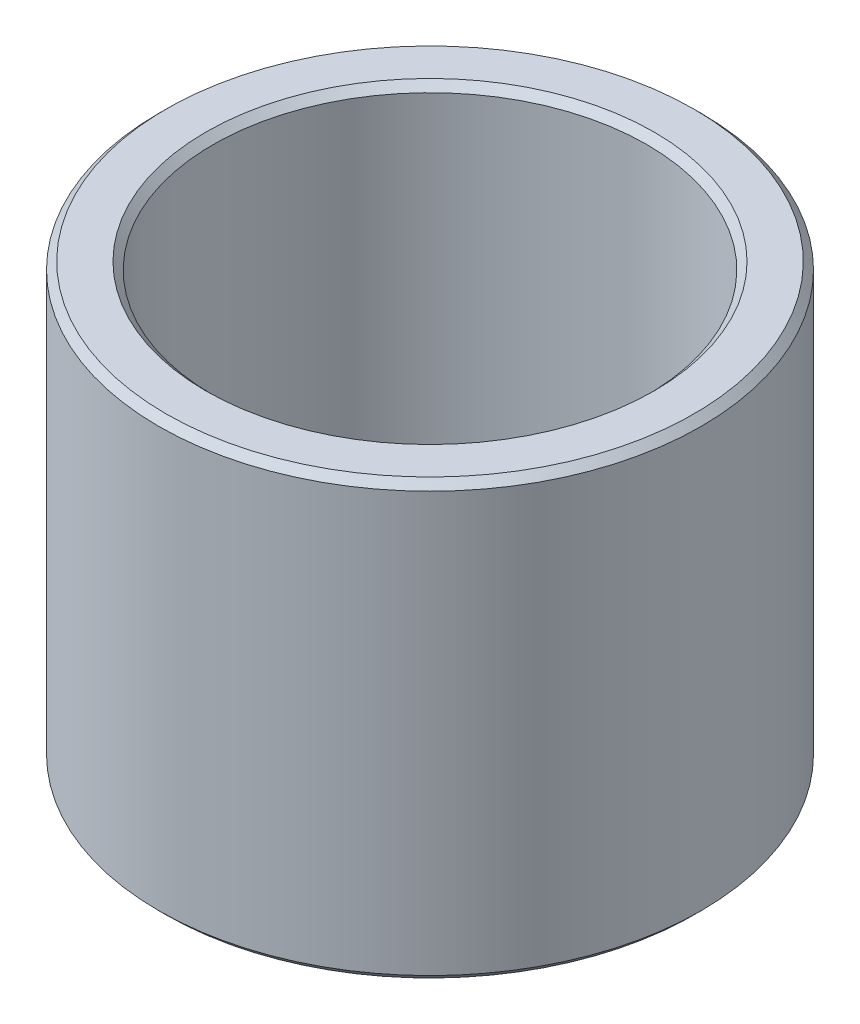
ISO-10303-21;
HEADER;
FILE_DESCRIPTION(('STEP AP214'),'2;1');
FILE_NAME('part.step','',(''),(''),'','','');
FILE_SCHEMA(('AUTOMOTIVE_DESIGN { 1 0 10303 214 1 1 1 1 }'));
ENDSEC;
DATA;
#1=APPLICATION_CONTEXT('core data for automotive mechanical design processes');
#2=APPLICATION_PROTOCOL_DEFINITION('international standard','automotive_design',2000,#1);
#3=PRODUCT_CONTEXT('',#1,'mechanical');
#4=PRODUCT('Part','Part','',(#3));
#5=PRODUCT_RELATED_PRODUCT_CATEGORY('part','',(#4));
#6=PRODUCT_DEFINITION_FORMATION('','',#4);
#7=PRODUCT_DEFINITION_CONTEXT('part definition',#1,'design');
#8=PRODUCT_DEFINITION('design','',#6,#7);
#9=PRODUCT_DEFINITION_SHAPE('','',#8);
#10=(LENGTH_UNIT() NAMED_UNIT(*) SI_UNIT(.MILLI.,.METRE.));
#11=(NAMED_UNIT(*) PLANE_ANGLE_UNIT() SI_UNIT($,.RADIAN.));
#12=(NAMED_UNIT(*) SI_UNIT($,.STERADIAN.) SOLID_ANGLE_UNIT());
#13=UNCERTAINTY_MEASURE_WITH_UNIT(LENGTH_MEASURE(1.E-05),#10,'distance_accuracy_value','');
#14=(GEOMETRIC_REPRESENTATION_CONTEXT(3) GLOBAL_UNCERTAINTY_ASSIGNED_CONTEXT((#13)) GLOBAL_UNIT_ASSIGNED_CONTEXT((#10,
#11,#12)) REPRESENTATION_CONTEXT('',''));
#15=CARTESIAN_POINT('',(0.,0.,0.));
#16=DIRECTION('',(0.,0.,1.));
#17=DIRECTION('',(1.,0.,0.));
#18=AXIS2_PLACEMENT_3D('',#15,#16,#17);
#19=CARTESIAN_POINT('',(0.,1.5,0.));
#20=DIRECTION('',(0.,1.,0.));
#21=DIRECTION('',(0.,0.,1.));
#22=AXIS2_PLACEMENT_3D('',#19,#20,#21);
#23=PLANE('',#22);
#24=CARTESIAN_POINT('',(0.,1.5,0.));
#25=DIRECTION('',(0.,1.,0.));
#26=DIRECTION('',(0.,0.,1.));
#27=AXIS2_PLACEMENT_3D('',#24,#25,#26);
#28=CIRCLE('',#27,12.);
#29=CARTESIAN_POINT('',(0.,1.5,12.));
#30=VERTEX_POINT('',#29);
#31=EDGE_CURVE('E37',#30,#30,#28,.T.);
#32=ORIENTED_EDGE('',*,*,#31,.T.);
#33=EDGE_LOOP('',(#32));
#34=FACE_BOUND('',#33,.T.);
#35=ADVANCED_FACE('F14',(#34),#23,.T.);
#36=CARTESIAN_POINT('',(0.,1.5,0.));
#37=DIRECTION('',(0.,1.,0.));
#38=DIRECTION('',(0.,0.,1.));
#39=AXIS2_PLACEMENT_3D('',#36,#37,#38);
#40=CYLINDRICAL_SURFACE('',#39,12.);
#41=ORIENTED_EDGE('',*,*,#31,.F.);
#42=EDGE_LOOP('',(#41));
#43=FACE_BOUND('',#42,.T.);
#44=CARTESIAN_POINT('',(0.,23.6,0.));
#45=DIRECTION('',(0.,1.,0.));
#46=DIRECTION('',(0.,0.,1.));
#47=AXIS2_PLACEMENT_3D('',#44,#45,#46);
#48=CIRCLE('',#47,12.);
#49=CARTESIAN_POINT('',(0.,23.6,12.));
#50=VERTEX_POINT('',#49);
#51=EDGE_CURVE('E33',#50,#50,#48,.T.);
#52=ORIENTED_EDGE('',*,*,#51,.T.);
#53=EDGE_LOOP('',(#52));
#54=FACE_BOUND('',#53,.T.);
#55=ADVANCED_FACE('F56',(#43,#54),#40,.F.);
#56=CARTESIAN_POINT('',(0.,24.,0.));
#57=DIRECTION('',(0.,1.,0.));
#58=DIRECTION('',(0.,0.,1.));
#59=AXIS2_PLACEMENT_3D('',#56,#57,#58);
#60=CONICAL_SURFACE('',#59,12.4,0.78539816339745);
#61=ORIENTED_EDGE('',*,*,#51,.F.);
#62=EDGE_LOOP('',(#61));
#63=FACE_BOUND('',#62,.T.);
#64=CARTESIAN_POINT('',(0.,24.,0.));
#65=DIRECTION('',(0.,1.,0.));
#66=DIRECTION('',(0.,0.,1.));
#67=AXIS2_PLACEMENT_3D('',#64,#65,#66);
#68=CIRCLE('',#67,12.4);
#69=CARTESIAN_POINT('',(0.,24.,12.4));
#70=VERTEX_POINT('',#69);
#71=EDGE_CURVE('E36',#70,#70,#68,.F.);
#72=ORIENTED_EDGE('',*,*,#71,.F.);
#73=EDGE_LOOP('',(#72));
#74=FACE_BOUND('',#73,.T.);
#75=ADVANCED_FACE('F59',(#63,#74),#60,.F.);
#76=CARTESIAN_POINT('',(0.,0.,0.));
#77=DIRECTION('',(0.,1.,0.));
#78=DIRECTION('',(0.,0.,1.));
#79=AXIS2_PLACEMENT_3D('',#76,#77,#78);
#80=PLANE('',#79);
#81=CARTESIAN_POINT('',(0.,0.,0.));
#82=DIRECTION('',(0.,1.,0.));
#83=DIRECTION('',(0.,0.,1.));
#84=AXIS2_PLACEMENT_3D('',#81,#82,#83);
#85=CIRCLE('',#84,14.6);
#86=CARTESIAN_POINT('',(0.,0.,14.6));
#87=VERTEX_POINT('',#86);
#88=EDGE_CURVE('E42',#87,#87,#85,.T.);
#89=ORIENTED_EDGE('',*,*,#88,.F.);
#90=EDGE_LOOP('',(#89));
#91=FACE_BOUND('',#90,.T.);
#92=ADVANCED_FACE('F64',(#91),#80,.F.);
#93=CARTESIAN_POINT('',(0.,24.,0.));
#94=DIRECTION('',(0.,1.,0.));
#95=DIRECTION('',(0.,0.,1.));
#96=AXIS2_PLACEMENT_3D('',#93,#94,#95);
#97=PLANE('',#96);
#98=ORIENTED_EDGE('',*,*,#71,.T.);
#99=EDGE_LOOP('',(#98));
#100=FACE_BOUND('',#99,.T.);
#101=CARTESIAN_POINT('',(0.,24.,0.));
#102=DIRECTION('',(0.,-1.,0.));
#103=DIRECTION('',(0.,0.,-1.));
#104=AXIS2_PLACEMENT_3D('',#101,#102,#103);
#105=CIRCLE('',#104,14.6);
#106=CARTESIAN_POINT('',(0.,24.,-14.6));
#107=VERTEX_POINT('',#106);
#108=EDGE_CURVE('E26',#107,#107,#105,.T.);
#109=ORIENTED_EDGE('',*,*,#108,.F.);
#110=EDGE_LOOP('',(#109));
#111=FACE_BOUND('',#110,.T.);
#112=ADVANCED_FACE('F68',(#100,#111),#97,.T.);
#113=CARTESIAN_POINT('',(0.,0.399999999999998,0.));
#114=DIRECTION('',(0.,1.,0.));
#115=DIRECTION('',(0.,0.,1.));
#116=AXIS2_PLACEMENT_3D('',#113,#114,#115);
#117=CONICAL_SURFACE('',#116,15.,0.78539816339745);
#118=CARTESIAN_POINT('',(0.,0.399999999999998,0.));
#119=DIRECTION('',(0.,-1.,0.));
#120=DIRECTION('',(0.,0.,-1.));
#121=AXIS2_PLACEMENT_3D('',#118,#119,#120);
#122=CIRCLE('',#121,15.);
#123=CARTESIAN_POINT('',(0.,0.399999999999998,-15.));
#124=VERTEX_POINT('',#123);
#125=EDGE_CURVE('E21',#124,#124,#122,.F.);
#126=ORIENTED_EDGE('',*,*,#125,.F.);
#127=EDGE_LOOP('',(#126));
#128=FACE_BOUND('',#127,.T.);
#129=ORIENTED_EDGE('',*,*,#88,.T.);
#130=EDGE_LOOP('',(#129));
#131=FACE_BOUND('',#130,.T.);
#132=ADVANCED_FACE('F71',(#128,#131),#117,.T.);
#133=CARTESIAN_POINT('',(0.,23.6,0.));
#134=DIRECTION('',(0.,-1.,0.));
#135=DIRECTION('',(0.,0.,-1.));
#136=AXIS2_PLACEMENT_3D('',#133,#134,#135);
#137=CONICAL_SURFACE('',#136,15.,0.78539816339744);
#138=ORIENTED_EDGE('',*,*,#108,.T.);
#139=EDGE_LOOP('',(#138));
#140=FACE_BOUND('',#139,.T.);
#141=CARTESIAN_POINT('',(0.,23.6,0.));
#142=DIRECTION('',(0.,-1.,0.));
#143=DIRECTION('',(0.,0.,-1.));
#144=AXIS2_PLACEMENT_3D('',#141,#142,#143);
#145=CIRCLE('',#144,15.);
#146=CARTESIAN_POINT('',(0.,23.6,-15.));
#147=VERTEX_POINT('',#146);
#148=EDGE_CURVE('E10',#147,#147,#145,.T.);
#149=ORIENTED_EDGE('',*,*,#148,.F.);
#150=EDGE_LOOP('',(#149));
#151=FACE_BOUND('',#150,.T.);
#152=ADVANCED_FACE('F75',(#140,#151),#137,.T.);
#153=CARTESIAN_POINT('',(0.,24.,0.));
#154=DIRECTION('',(0.,-1.,0.));
#155=DIRECTION('',(0.,0.,-1.));
#156=AXIS2_PLACEMENT_3D('',#153,#154,#155);
#157=CYLINDRICAL_SURFACE('',#156,15.);
#158=ORIENTED_EDGE('',*,*,#148,.T.);
#159=EDGE_LOOP('',(#158));
#160=FACE_BOUND('',#159,.T.);
#161=ORIENTED_EDGE('',*,*,#125,.T.);
#162=EDGE_LOOP('',(#161));
#163=FACE_BOUND('',#162,.T.);
#164=ADVANCED_FACE('F78',(#160,#163),#157,.T.);
#165=CLOSED_SHELL('',(#35,#55,#75,#92,#112,#132,#152,#164));
#166=MANIFOLD_SOLID_BREP('B1',#165);
#167=ADVANCED_BREP_SHAPE_REPRESENTATION('',(#18,#166),#14);
#168=SHAPE_DEFINITION_REPRESENTATION(#9,#167);
ENDSEC;
END-ISO-10303-21;
